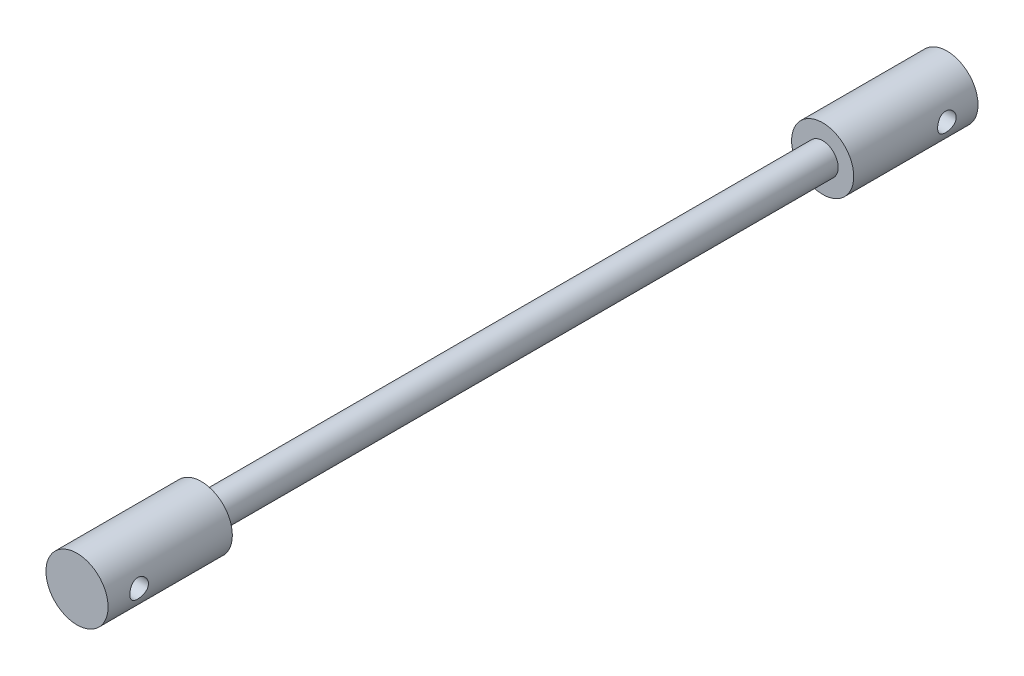
ISO-10303-21;
HEADER;
FILE_DESCRIPTION(('STEP AP214'),'2;1');
FILE_NAME('part.step','',(''),(''),'','','');
FILE_SCHEMA(('AUTOMOTIVE_DESIGN { 1 0 10303 214 1 1 1 1 }'));
ENDSEC;
DATA;
#1=APPLICATION_CONTEXT('core data for automotive mechanical design processes');
#2=APPLICATION_PROTOCOL_DEFINITION('international standard','automotive_design',2000,#1);
#3=PRODUCT_CONTEXT('',#1,'mechanical');
#4=PRODUCT('Part','Part','',(#3));
#5=PRODUCT_RELATED_PRODUCT_CATEGORY('part','',(#4));
#6=PRODUCT_DEFINITION_FORMATION('','',#4);
#7=PRODUCT_DEFINITION_CONTEXT('part definition',#1,'design');
#8=PRODUCT_DEFINITION('design','',#6,#7);
#9=PRODUCT_DEFINITION_SHAPE('','',#8);
#10=(LENGTH_UNIT() NAMED_UNIT(*) SI_UNIT(.MILLI.,.METRE.));
#11=(NAMED_UNIT(*) PLANE_ANGLE_UNIT() SI_UNIT($,.RADIAN.));
#12=(NAMED_UNIT(*) SI_UNIT($,.STERADIAN.) SOLID_ANGLE_UNIT());
#13=UNCERTAINTY_MEASURE_WITH_UNIT(LENGTH_MEASURE(1.E-05),#10,'distance_accuracy_value','');
#14=(GEOMETRIC_REPRESENTATION_CONTEXT(3) GLOBAL_UNCERTAINTY_ASSIGNED_CONTEXT((#13)) GLOBAL_UNIT_ASSIGNED_CONTEXT((#10,
#11,#12)) REPRESENTATION_CONTEXT('',''));
#15=CARTESIAN_POINT('',(0.,0.,0.));
#16=DIRECTION('',(0.,0.,1.));
#17=DIRECTION('',(1.,0.,0.));
#18=AXIS2_PLACEMENT_3D('',#15,#16,#17);
#19=CARTESIAN_POINT('',(0.,0.,20.));
#20=DIRECTION('',(0.,0.,1.));
#21=DIRECTION('',(1.,0.,0.));
#22=AXIS2_PLACEMENT_3D('',#19,#20,#21);
#23=PLANE('',#22);
#24=CARTESIAN_POINT('',(0.,0.,20.));
#25=DIRECTION('',(0.,0.,1.));
#26=DIRECTION('',(1.,0.,0.));
#27=AXIS2_PLACEMENT_3D('',#24,#25,#26);
#28=CIRCLE('',#27,5.);
#29=CARTESIAN_POINT('',(5.,0.,20.));
#30=VERTEX_POINT('',#29);
#31=EDGE_CURVE('E101',#30,#30,#28,.T.);
#32=ORIENTED_EDGE('',*,*,#31,.T.);
#33=EDGE_LOOP('',(#32));
#34=FACE_BOUND('',#33,.T.);
#35=CARTESIAN_POINT('',(0.,0.,20.));
#36=DIRECTION('',(0.,0.,1.));
#37=DIRECTION('',(1.,0.,0.));
#38=AXIS2_PLACEMENT_3D('',#35,#36,#37);
#39=CIRCLE('',#38,2.5);
#40=CARTESIAN_POINT('',(2.5,0.,20.));
#41=VERTEX_POINT('',#40);
#42=EDGE_CURVE('E102',#41,#41,#39,.T.);
#43=ORIENTED_EDGE('',*,*,#42,.F.);
#44=EDGE_LOOP('',(#43));
#45=FACE_BOUND('',#44,.T.);
#46=ADVANCED_FACE('F31',(#34,#45),#23,.T.);
#47=CARTESIAN_POINT('',(0.,0.,20.));
#48=DIRECTION('',(0.,0.,-1.));
#49=DIRECTION('',(-1.,0.,0.));
#50=AXIS2_PLACEMENT_3D('',#47,#48,#49);
#51=CYLINDRICAL_SURFACE('',#50,5.);
#52=CARTESIAN_POINT('',(-5.,0.,3.5));
#53=CARTESIAN_POINT('',(-4.9999992925055,0.0822886127532998,3.50000099748489));
#54=CARTESIAN_POINT('',(-4.99794915693954,0.164587318351529,3.50679386362397));
#55=CARTESIAN_POINT('',(-4.98997105593691,0.32678812530488,3.5337213542221));
#56=CARTESIAN_POINT('',(-4.98404193389692,0.406689504411419,3.55385995802334));
#57=CARTESIAN_POINT('',(-4.96895552501836,0.561732707754526,3.60674601691027));
#58=CARTESIAN_POINT('',(-4.95980300250425,0.636881364395372,3.63947486961894));
#59=CARTESIAN_POINT('',(-4.93922109237645,0.78062418105313,3.71653609305584));
#60=CARTESIAN_POINT('',(-4.92779140192067,0.849217467469668,3.76087000739542));
#61=CARTESIAN_POINT('',(-4.90350737192774,0.979871797183744,3.86122400747267));
#62=CARTESIAN_POINT('',(-4.89062383657036,1.04171807124434,3.91751662588591));
#63=CARTESIAN_POINT('',(-4.86505834210442,1.15524920923324,4.03960922991018));
#64=CARTESIAN_POINT('',(-4.85237641724501,1.20693236327441,4.10541081212496));
#65=CARTESIAN_POINT('',(-4.82834113993772,1.29980037723707,4.24647075303761));
#66=CARTESIAN_POINT('',(-4.81702406663875,1.34072309022213,4.32190846099074));
#67=CARTESIAN_POINT('',(-4.79743620394031,1.4092139477476,4.47898925423029));
#68=CARTESIAN_POINT('',(-4.78916468313311,1.43678529919973,4.56063084392798));
#69=CARTESIAN_POINT('',(-4.77690870838434,1.47701633682652,4.72539026613046));
#70=CARTESIAN_POINT('',(-4.77281069324533,1.49007196234677,4.80840274386394));
#71=CARTESIAN_POINT('',(-4.76902789749767,1.50213730614672,4.97553315621677));
#72=CARTESIAN_POINT('',(-4.76934204760571,1.50115042761078,5.05965081805909));
#73=CARTESIAN_POINT('',(-4.77424744067778,1.48546977199812,5.22338390860848));
#74=CARTESIAN_POINT('',(-4.77868388599141,1.47127205262685,5.30305225036224));
#75=CARTESIAN_POINT('',(-4.79108356228624,1.43037420427056,5.45881978627346));
#76=CARTESIAN_POINT('',(-4.79904714132351,1.40367284141641,5.53491862737433));
#77=CARTESIAN_POINT('',(-4.81772733074973,1.33816026653682,5.68260034966074));
#78=CARTESIAN_POINT('',(-4.82848016115952,1.29918816934642,5.75410708395526));
#79=CARTESIAN_POINT('',(-4.85150987000065,1.21035222588683,5.88973202201019));
#80=CARTESIAN_POINT('',(-4.86378711746991,1.16048574002588,5.95384842941378));
#81=CARTESIAN_POINT('',(-4.88911011297937,1.04881290765546,6.07568619076202));
#82=CARTESIAN_POINT('',(-4.90216654310498,0.986594907466971,6.13302866402967));
#83=CARTESIAN_POINT('',(-4.92712244063259,0.853263259313966,6.23655398406425));
#84=CARTESIAN_POINT('',(-4.9390218351841,0.782149051860887,6.28273612841443));
#85=CARTESIAN_POINT('',(-4.9604316006947,0.632355038342803,6.36285992246473));
#86=CARTESIAN_POINT('',(-4.96992543668314,0.55362774974795,6.39671751624986));
#87=CARTESIAN_POINT('',(-4.98533521832222,0.391245415603519,6.45059959009963));
#88=CARTESIAN_POINT('',(-4.99125216186999,0.307591751589581,6.47062792853249));
#89=CARTESIAN_POINT('',(-4.99868364643538,0.140952242668332,6.49565217789939));
#90=CARTESIAN_POINT('',(-5.0003485041779,0.0580500976011874,6.50116158580161));
#91=CARTESIAN_POINT('',(-4.9995292324176,-0.107499605823382,6.49843084428792));
#92=CARTESIAN_POINT('',(-4.99704565677756,-0.19014719669078,6.49019253034856));
#93=CARTESIAN_POINT('',(-4.98830696987163,-0.350903605309696,6.4606153888885));
#94=CARTESIAN_POINT('',(-4.98213829799417,-0.429072772614168,6.43957661241913));
#95=CARTESIAN_POINT('',(-4.96674347841533,-0.580754638954521,6.3853567672218));
#96=CARTESIAN_POINT('',(-4.95751696321085,-0.654266777025583,6.35217423896214));
#97=CARTESIAN_POINT('',(-4.93669654351325,-0.796437189461051,6.27374683451887));
#98=CARTESIAN_POINT('',(-4.92505280829675,-0.864943826199668,6.22824065905203));
#99=CARTESIAN_POINT('',(-4.90073468764318,-0.993523307980145,6.12677524594719));
#100=CARTESIAN_POINT('',(-4.8880600443108,-1.05359403235593,6.07081338811233));
#101=CARTESIAN_POINT('',(-4.86253171869138,-1.16585744551027,5.94761269163065));
#102=CARTESIAN_POINT('',(-4.84968825033268,-1.21768481231503,5.88003812422826));
#103=CARTESIAN_POINT('',(-4.82576515238464,-1.30928995072153,5.73687206098647));
#104=CARTESIAN_POINT('',(-4.81468547654651,-1.34906803829472,5.66128077544179));
#105=CARTESIAN_POINT('',(-4.79567189615055,-1.41517347127168,5.50446750874531));
#106=CARTESIAN_POINT('',(-4.78772337843827,-1.4415634693705,5.42327381346341));
#107=CARTESIAN_POINT('',(-4.77591594362794,-1.48021730815114,5.25731203106852));
#108=CARTESIAN_POINT('',(-4.772055625083,-1.49248598978779,5.17254517921233));
#109=CARTESIAN_POINT('',(-4.76899972496087,-1.50221984485059,5.00563848162377));
#110=CARTESIAN_POINT('',(-4.76961647442754,-1.5002805530849,4.92353634898241));
#111=CARTESIAN_POINT('',(-4.77499401288294,-1.48307505444813,4.7608858966272));
#112=CARTESIAN_POINT('',(-4.77975463592551,-1.46780938124716,4.68033751482365));
#113=CARTESIAN_POINT('',(-4.79275763670386,-1.42476888804136,4.52405460085715));
#114=CARTESIAN_POINT('',(-4.80095604545965,-1.39715175507068,4.44827271263831));
#115=CARTESIAN_POINT('',(-4.81990278909136,-1.33031507121129,4.30235756118228));
#116=CARTESIAN_POINT('',(-4.83065161194312,-1.29109329962876,4.23222538235924));
#117=CARTESIAN_POINT('',(-4.85397676425833,-1.20048763805072,4.09683688347289));
#118=CARTESIAN_POINT('',(-4.86660540163798,-1.14871276092994,4.03185123873959));
#119=CARTESIAN_POINT('',(-4.89201320450026,-1.03517434629782,3.91129750169214));
#120=CARTESIAN_POINT('',(-4.90479240823905,-0.973408217134501,3.85573186053224));
#121=CARTESIAN_POINT('',(-4.92950936570649,-0.839465762183248,3.75397658770497));
#122=CARTESIAN_POINT('',(-4.94141159765674,-0.767037885790608,3.70810855314451));
#123=CARTESIAN_POINT('',(-4.96260680455813,-0.615141373983529,3.62926483009598));
#124=CARTESIAN_POINT('',(-4.97190099931067,-0.535676052998955,3.59628311172549));
#125=CARTESIAN_POINT('',(-4.98602174969301,-0.380757712655282,3.54710472434725));
#126=CARTESIAN_POINT('',(-4.99122027381068,-0.305786961954234,3.52948832711675));
#127=CARTESIAN_POINT('',(-4.99820944494492,-0.15388019523078,3.50593647475842));
#128=CARTESIAN_POINT('',(-5.0000006615474,-0.0769445098581396,3.49999906729518));
#129=CARTESIAN_POINT('',(-5.,0.,3.5));
#130=B_SPLINE_CURVE_WITH_KNOTS('',3,(#52,#53,#54,#55,#56,#57,#58,#59,#60,#61,#62,#63,#64,#65,
#66,#67,#68,#69,#70,#71,#72,#73,#74,#75,#76,#77,#78,#79,#80,#81,#82,#83,#84,#85,#86,#87,#88,#89,
#90,#91,#92,#93,#94,#95,#96,#97,#98,#99,#100,#101,#102,#103,#104,#105,#106,#107,#108,#109,#110,
#111,#112,#113,#114,#115,#116,#117,#118,#119,#120,#121,#122,#123,#124,#125,#126,#127,#128,#129),
.UNSPECIFIED.,.T.,.F.,(4,2,2,2,2,2,2,2,2,2,2,2,2,2,2,2,2,2,2,2,2,2,2,2,2,2,2,2,2,2,2,2,2,2,2,2,
2,2,4),(0.,0.24658320361261,0.493239964845999,0.739533676300873,0.9858601644127,
1.23855602948191,1.49129437288633,1.74971481004109,2.00807314543223,2.25919689356599,
2.51025978319089,2.75226016697676,2.99428443658001,3.23962426447119,3.48502360158555,
3.74067104048166,3.99633456531071,4.25371046881688,4.51101453528807,4.75908809438544,
5.00712853550326,5.24956746682326,5.49203554593728,5.74011305702908,5.9882528200019,
6.24540400322818,6.5025484425268,6.75847814951251,7.01432009460282,7.25950155466942,
7.50467319661599,7.7468004040272,7.98897397553106,8.2399692567993,8.49102974897501,
8.7494299615667,9.00770911595234,9.23831691930458,9.46888616948873),.UNSPECIFIED.);
#131=CARTESIAN_POINT('',(-5.,0.,3.5));
#132=VERTEX_POINT('',#131);
#133=EDGE_CURVE('E47',#132,#132,#130,.T.);
#134=ORIENTED_EDGE('',*,*,#133,.T.);
#135=EDGE_LOOP('',(#134));
#136=FACE_BOUND('',#135,.T.);
#137=CARTESIAN_POINT('',(5.,0.,3.5));
#138=CARTESIAN_POINT('',(4.9999992925055,-0.0822886127532998,3.50000099748489));
#139=CARTESIAN_POINT('',(4.99794915693954,-0.164587318351529,3.50679386362397));
#140=CARTESIAN_POINT('',(4.98997105593691,-0.32678812530488,3.5337213542221));
#141=CARTESIAN_POINT('',(4.98404193389692,-0.406689504411419,3.55385995802334));
#142=CARTESIAN_POINT('',(4.96895552501836,-0.561732707754526,3.60674601691027));
#143=CARTESIAN_POINT('',(4.95980300250425,-0.636881364395372,3.63947486961894));
#144=CARTESIAN_POINT('',(4.93922109237645,-0.78062418105313,3.71653609305584));
#145=CARTESIAN_POINT('',(4.92779140192067,-0.849217467469668,3.76087000739542));
#146=CARTESIAN_POINT('',(4.90350737192774,-0.979871797183744,3.86122400747267));
#147=CARTESIAN_POINT('',(4.89062383657036,-1.04171807124434,3.91751662588591));
#148=CARTESIAN_POINT('',(4.86505834210442,-1.15524920923324,4.03960922991018));
#149=CARTESIAN_POINT('',(4.85237641724501,-1.20693236327441,4.10541081212496));
#150=CARTESIAN_POINT('',(4.82834113993772,-1.29980037723707,4.24647075303761));
#151=CARTESIAN_POINT('',(4.81702406663875,-1.34072309022213,4.32190846099074));
#152=CARTESIAN_POINT('',(4.79743620394031,-1.4092139477476,4.47898925423029));
#153=CARTESIAN_POINT('',(4.78916468313311,-1.43678529919973,4.56063084392798));
#154=CARTESIAN_POINT('',(4.77690870838434,-1.47701633682652,4.72539026613046));
#155=CARTESIAN_POINT('',(4.77281069324533,-1.49007196234677,4.80840274386394));
#156=CARTESIAN_POINT('',(4.76902789749767,-1.50213730614672,4.97553315621677));
#157=CARTESIAN_POINT('',(4.76934204760571,-1.50115042761078,5.05965081805909));
#158=CARTESIAN_POINT('',(4.77424744067778,-1.48546977199812,5.22338390860848));
#159=CARTESIAN_POINT('',(4.77868388599141,-1.47127205262685,5.30305225036224));
#160=CARTESIAN_POINT('',(4.79108356228624,-1.43037420427056,5.45881978627346));
#161=CARTESIAN_POINT('',(4.79904714132351,-1.40367284141641,5.53491862737433));
#162=CARTESIAN_POINT('',(4.81772733074973,-1.33816026653682,5.68260034966074));
#163=CARTESIAN_POINT('',(4.82848016115952,-1.29918816934642,5.75410708395526));
#164=CARTESIAN_POINT('',(4.85150987000065,-1.21035222588683,5.88973202201019));
#165=CARTESIAN_POINT('',(4.86378711746991,-1.16048574002588,5.95384842941378));
#166=CARTESIAN_POINT('',(4.88911011297937,-1.04881290765546,6.07568619076202));
#167=CARTESIAN_POINT('',(4.90216654310498,-0.986594907466971,6.13302866402967));
#168=CARTESIAN_POINT('',(4.92712244063259,-0.853263259313966,6.23655398406425));
#169=CARTESIAN_POINT('',(4.9390218351841,-0.782149051860887,6.28273612841443));
#170=CARTESIAN_POINT('',(4.9604316006947,-0.632355038342803,6.36285992246473));
#171=CARTESIAN_POINT('',(4.96992543668314,-0.55362774974795,6.39671751624986));
#172=CARTESIAN_POINT('',(4.98533521832222,-0.391245415603519,6.45059959009963));
#173=CARTESIAN_POINT('',(4.99125216186999,-0.307591751589581,6.47062792853249));
#174=CARTESIAN_POINT('',(4.99868364643538,-0.140952242668332,6.49565217789939));
#175=CARTESIAN_POINT('',(5.0003485041779,-0.0580500976011874,6.50116158580161));
#176=CARTESIAN_POINT('',(4.9995292324176,0.107499605823382,6.49843084428792));
#177=CARTESIAN_POINT('',(4.99704565677756,0.19014719669078,6.49019253034856));
#178=CARTESIAN_POINT('',(4.98830696987163,0.350903605309696,6.4606153888885));
#179=CARTESIAN_POINT('',(4.98213829799417,0.429072772614168,6.43957661241913));
#180=CARTESIAN_POINT('',(4.96674347841533,0.580754638954521,6.3853567672218));
#181=CARTESIAN_POINT('',(4.95751696321085,0.654266777025583,6.35217423896214));
#182=CARTESIAN_POINT('',(4.93669654351325,0.796437189461051,6.27374683451887));
#183=CARTESIAN_POINT('',(4.92505280829675,0.864943826199668,6.22824065905203));
#184=CARTESIAN_POINT('',(4.90073468764318,0.993523307980145,6.12677524594719));
#185=CARTESIAN_POINT('',(4.8880600443108,1.05359403235593,6.07081338811233));
#186=CARTESIAN_POINT('',(4.86253171869138,1.16585744551027,5.94761269163065));
#187=CARTESIAN_POINT('',(4.84968825033268,1.21768481231503,5.88003812422826));
#188=CARTESIAN_POINT('',(4.82576515238464,1.30928995072153,5.73687206098647));
#189=CARTESIAN_POINT('',(4.81468547654651,1.34906803829472,5.66128077544179));
#190=CARTESIAN_POINT('',(4.79567189615055,1.41517347127168,5.50446750874531));
#191=CARTESIAN_POINT('',(4.78772337843827,1.4415634693705,5.42327381346341));
#192=CARTESIAN_POINT('',(4.77591594362794,1.48021730815114,5.25731203106852));
#193=CARTESIAN_POINT('',(4.772055625083,1.49248598978779,5.17254517921233));
#194=CARTESIAN_POINT('',(4.76899972496087,1.50221984485059,5.00563848162377));
#195=CARTESIAN_POINT('',(4.76961647442754,1.5002805530849,4.92353634898241));
#196=CARTESIAN_POINT('',(4.77499401288294,1.48307505444813,4.7608858966272));
#197=CARTESIAN_POINT('',(4.77975463592551,1.46780938124716,4.68033751482365));
#198=CARTESIAN_POINT('',(4.79275763670386,1.42476888804136,4.52405460085715));
#199=CARTESIAN_POINT('',(4.80095604545965,1.39715175507068,4.44827271263831));
#200=CARTESIAN_POINT('',(4.81990278909136,1.33031507121129,4.30235756118228));
#201=CARTESIAN_POINT('',(4.83065161194312,1.29109329962876,4.23222538235924));
#202=CARTESIAN_POINT('',(4.85397676425833,1.20048763805072,4.09683688347289));
#203=CARTESIAN_POINT('',(4.86660540163798,1.14871276092994,4.03185123873959));
#204=CARTESIAN_POINT('',(4.89201320450026,1.03517434629782,3.91129750169214));
#205=CARTESIAN_POINT('',(4.90479240823905,0.973408217134501,3.85573186053224));
#206=CARTESIAN_POINT('',(4.92950936570649,0.839465762183248,3.75397658770497));
#207=CARTESIAN_POINT('',(4.94141159765674,0.767037885790608,3.70810855314451));
#208=CARTESIAN_POINT('',(4.96260680455813,0.615141373983529,3.62926483009598));
#209=CARTESIAN_POINT('',(4.97190099931067,0.535676052998955,3.59628311172549));
#210=CARTESIAN_POINT('',(4.98602174969301,0.380757712655282,3.54710472434725));
#211=CARTESIAN_POINT('',(4.99122027381068,0.305786961954234,3.52948832711675));
#212=CARTESIAN_POINT('',(4.99820944494492,0.15388019523078,3.50593647475842));
#213=CARTESIAN_POINT('',(5.0000006615474,0.0769445098581396,3.49999906729518));
#214=CARTESIAN_POINT('',(5.,0.,3.5));
#215=B_SPLINE_CURVE_WITH_KNOTS('',3,(#137,#138,#139,#140,#141,#142,#143,#144,#145,#146,#147,
#148,#149,#150,#151,#152,#153,#154,#155,#156,#157,#158,#159,#160,#161,#162,#163,#164,#165,#166,
#167,#168,#169,#170,#171,#172,#173,#174,#175,#176,#177,#178,#179,#180,#181,#182,#183,#184,#185,
#186,#187,#188,#189,#190,#191,#192,#193,#194,#195,#196,#197,#198,#199,#200,#201,#202,#203,#204,
#205,#206,#207,#208,#209,#210,#211,#212,#213,#214),.UNSPECIFIED.,.T.,.F.,(4,2,2,2,2,2,2,2,2,2,2,
2,2,2,2,2,2,2,2,2,2,2,2,2,2,2,2,2,2,2,2,2,2,2,2,2,2,2,4),(0.,0.24658320361261,0.493239964845999,
0.739533676300873,0.9858601644127,1.23855602948191,1.49129437288633,1.74971481004109,
2.00807314543223,2.25919689356599,2.51025978319089,2.75226016697676,2.99428443658001,
3.23962426447119,3.48502360158555,3.74067104048166,3.99633456531071,4.25371046881688,
4.51101453528807,4.75908809438544,5.00712853550326,5.24956746682326,5.49203554593728,
5.74011305702908,5.9882528200019,6.24540400322818,6.5025484425268,6.75847814951251,
7.01432009460282,7.25950155466942,7.50467319661599,7.7468004040272,7.98897397553106,
8.2399692567993,8.49102974897501,8.7494299615667,9.00770911595234,9.23831691930458,
9.46888616948873),.UNSPECIFIED.);
#216=CARTESIAN_POINT('',(5.,0.,3.5));
#217=VERTEX_POINT('',#216);
#218=EDGE_CURVE('E51',#217,#217,#215,.T.);
#219=ORIENTED_EDGE('',*,*,#218,.T.);
#220=EDGE_LOOP('',(#219));
#221=FACE_BOUND('',#220,.T.);
#222=ORIENTED_EDGE('',*,*,#31,.F.);
#223=EDGE_LOOP('',(#222));
#224=FACE_BOUND('',#223,.T.);
#225=CARTESIAN_POINT('',(0.,0.,0.));
#226=DIRECTION('',(0.,0.,1.));
#227=DIRECTION('',(1.,0.,0.));
#228=AXIS2_PLACEMENT_3D('',#225,#226,#227);
#229=CIRCLE('',#228,5.);
#230=CARTESIAN_POINT('',(5.,0.,0.));
#231=VERTEX_POINT('',#230);
#232=EDGE_CURVE('E99',#231,#231,#229,.T.);
#233=ORIENTED_EDGE('',*,*,#232,.T.);
#234=EDGE_LOOP('',(#233));
#235=FACE_BOUND('',#234,.T.);
#236=ADVANCED_FACE('F33',(#136,#221,#224,#235),#51,.T.);
#237=CARTESIAN_POINT('',(0.,0.,0.));
#238=DIRECTION('',(0.,0.,1.));
#239=DIRECTION('',(1.,0.,0.));
#240=AXIS2_PLACEMENT_3D('',#237,#238,#239);
#241=PLANE('',#240);
#242=ORIENTED_EDGE('',*,*,#232,.F.);
#243=EDGE_LOOP('',(#242));
#244=FACE_BOUND('',#243,.T.);
#245=ADVANCED_FACE('F85',(#244),#241,.F.);
#246=CARTESIAN_POINT('',(0.,0.,70.));
#247=DIRECTION('',(0.,0.,-1.));
#248=DIRECTION('',(-1.,0.,0.));
#249=AXIS2_PLACEMENT_3D('',#246,#247,#248);
#250=CYLINDRICAL_SURFACE('',#249,2.5);
#251=ORIENTED_EDGE('',*,*,#42,.T.);
#252=EDGE_LOOP('',(#251));
#253=FACE_BOUND('',#252,.T.);
#254=CARTESIAN_POINT('',(0.,0.,120.));
#255=DIRECTION('',(0.,0.,1.));
#256=DIRECTION('',(1.,0.,0.));
#257=AXIS2_PLACEMENT_3D('',#254,#255,#256);
#258=CIRCLE('',#257,2.5);
#259=CARTESIAN_POINT('',(2.5,0.,120.));
#260=VERTEX_POINT('',#259);
#261=EDGE_CURVE('E106',#260,#260,#258,.T.);
#262=ORIENTED_EDGE('',*,*,#261,.F.);
#263=EDGE_LOOP('',(#262));
#264=FACE_BOUND('',#263,.T.);
#265=ADVANCED_FACE('F90',(#253,#264),#250,.T.);
#266=CARTESIAN_POINT('',(-5.,0.,5.));
#267=DIRECTION('',(1.,0.,0.));
#268=DIRECTION('',(0.,0.,-1.));
#269=AXIS2_PLACEMENT_3D('',#266,#267,#268);
#270=CYLINDRICAL_SURFACE('',#269,1.5);
#271=ORIENTED_EDGE('',*,*,#218,.F.);
#272=EDGE_LOOP('',(#271));
#273=FACE_BOUND('',#272,.T.);
#274=ORIENTED_EDGE('',*,*,#133,.F.);
#275=EDGE_LOOP('',(#274));
#276=FACE_BOUND('',#275,.T.);
#277=ADVANCED_FACE('F70',(#273,#276),#270,.F.);
#278=CARTESIAN_POINT('',(0.,0.,120.));
#279=DIRECTION('',(0.,0.,-1.));
#280=DIRECTION('',(1.,0.,0.));
#281=AXIS2_PLACEMENT_3D('',#278,#279,#280);
#282=PLANE('',#281);
#283=CARTESIAN_POINT('',(0.,0.,120.));
#284=DIRECTION('',(0.,0.,1.));
#285=DIRECTION('',(1.,0.,0.));
#286=AXIS2_PLACEMENT_3D('',#283,#284,#285);
#287=CIRCLE('',#286,5.);
#288=CARTESIAN_POINT('',(5.,0.,120.));
#289=VERTEX_POINT('',#288);
#290=EDGE_CURVE('E175',#289,#289,#287,.T.);
#291=ORIENTED_EDGE('',*,*,#290,.F.);
#292=EDGE_LOOP('',(#291));
#293=FACE_BOUND('',#292,.T.);
#294=ORIENTED_EDGE('',*,*,#261,.T.);
#295=EDGE_LOOP('',(#294));
#296=FACE_BOUND('',#295,.T.);
#297=ADVANCED_FACE('F67',(#293,#296),#282,.T.);
#298=CARTESIAN_POINT('',(0.,0.,120.));
#299=DIRECTION('',(0.,0.,1.));
#300=DIRECTION('',(1.,0.,0.));
#301=AXIS2_PLACEMENT_3D('',#298,#299,#300);
#302=CYLINDRICAL_SURFACE('',#301,5.);
#303=CARTESIAN_POINT('',(-5.,0.,133.5));
#304=CARTESIAN_POINT('',(-4.9999992925055,-0.0822886127533159,133.500000997485));
#305=CARTESIAN_POINT('',(-4.99794915693954,-0.164587318351546,133.506793863624));
#306=CARTESIAN_POINT('',(-4.98997105593691,-0.326788125304897,133.533721354222));
#307=CARTESIAN_POINT('',(-4.98404193389692,-0.406689504411434,133.553859958023));
#308=CARTESIAN_POINT('',(-4.96895552501836,-0.561732707754537,133.60674601691));
#309=CARTESIAN_POINT('',(-4.95980300250425,-0.636881364395381,133.639474869619));
#310=CARTESIAN_POINT('',(-4.93922109237645,-0.78062418105314,133.716536093056));
#311=CARTESIAN_POINT('',(-4.92779140192066,-0.849217467469681,133.760870007395));
#312=CARTESIAN_POINT('',(-4.90350737192774,-0.979871797183756,133.861224007473));
#313=CARTESIAN_POINT('',(-4.89062383657036,-1.04171807124435,133.917516625886));
#314=CARTESIAN_POINT('',(-4.86505834210442,-1.15524920923324,134.03960922991));
#315=CARTESIAN_POINT('',(-4.85237641724501,-1.20693236327441,134.105410812125));
#316=CARTESIAN_POINT('',(-4.82834113993772,-1.29980037723708,134.246470753038));
#317=CARTESIAN_POINT('',(-4.81702406663875,-1.34072309022214,134.321908460991));
#318=CARTESIAN_POINT('',(-4.79743620394031,-1.40921394774761,134.47898925423));
#319=CARTESIAN_POINT('',(-4.7891646831331,-1.43678529919974,134.560630843928));
#320=CARTESIAN_POINT('',(-4.77690870838434,-1.47701633682653,134.72539026613));
#321=CARTESIAN_POINT('',(-4.77281069324533,-1.49007196234679,134.808402743864));
#322=CARTESIAN_POINT('',(-4.76902789749767,-1.50213730614673,134.975533156217));
#323=CARTESIAN_POINT('',(-4.76934204760571,-1.5011504276108,135.059650818059));
#324=CARTESIAN_POINT('',(-4.77424744067777,-1.48546977199813,135.223383908608));
#325=CARTESIAN_POINT('',(-4.7786838859914,-1.47127205262687,135.303052250362));
#326=CARTESIAN_POINT('',(-4.79108356228623,-1.43037420427058,135.458819786273));
#327=CARTESIAN_POINT('',(-4.7990471413235,-1.40367284141643,135.534918627374));
#328=CARTESIAN_POINT('',(-4.81772733074972,-1.33816026653684,135.682600349661));
#329=CARTESIAN_POINT('',(-4.82848016115951,-1.29918816934645,135.754107083955));
#330=CARTESIAN_POINT('',(-4.85150987000064,-1.21035222588686,135.88973202201));
#331=CARTESIAN_POINT('',(-4.8637871174699,-1.16048574002591,135.953848429414));
#332=CARTESIAN_POINT('',(-4.88911011297937,-1.04881290765549,136.075686190762));
#333=CARTESIAN_POINT('',(-4.90216654310497,-0.986594907467001,136.13302866403));
#334=CARTESIAN_POINT('',(-4.92712244063258,-0.853263259313991,136.236553984064));
#335=CARTESIAN_POINT('',(-4.9390218351841,-0.782149051860904,136.282736128414));
#336=CARTESIAN_POINT('',(-4.9604316006947,-0.632355038342814,136.362859922465));
#337=CARTESIAN_POINT('',(-4.96992543668314,-0.553627749747963,136.39671751625));
#338=CARTESIAN_POINT('',(-4.98533521832222,-0.391245415603533,136.4505995901));
#339=CARTESIAN_POINT('',(-4.99125216186999,-0.307591751589593,136.470627928533));
#340=CARTESIAN_POINT('',(-4.99868364643538,-0.140952242668344,136.495652177899));
#341=CARTESIAN_POINT('',(-5.0003485041779,-0.0580500976012007,136.501161585802));
#342=CARTESIAN_POINT('',(-4.9995292324176,0.107499605823366,136.498430844288));
#343=CARTESIAN_POINT('',(-4.99704565677756,0.190147196690763,136.490192530349));
#344=CARTESIAN_POINT('',(-4.98830696987163,0.350903605309677,136.460615388888));
#345=CARTESIAN_POINT('',(-4.98213829799417,0.429072772614148,136.439576612419));
#346=CARTESIAN_POINT('',(-4.96674347841533,0.580754638954502,136.385356767222));
#347=CARTESIAN_POINT('',(-4.95751696321085,0.654266777025566,136.352174238962));
#348=CARTESIAN_POINT('',(-4.93669654351325,0.796437189461033,136.273746834519));
#349=CARTESIAN_POINT('',(-4.92505280829675,0.864943826199646,136.228240659052));
#350=CARTESIAN_POINT('',(-4.90073468764318,0.993523307980123,136.126775245947));
#351=CARTESIAN_POINT('',(-4.8880600443108,1.05359403235591,136.070813388112));
#352=CARTESIAN_POINT('',(-4.86253171869138,1.16585744551026,135.947612691631));
#353=CARTESIAN_POINT('',(-4.84968825033268,1.21768481231503,135.880038124228));
#354=CARTESIAN_POINT('',(-4.82576515238464,1.30928995072152,135.736872060986));
#355=CARTESIAN_POINT('',(-4.81468547654652,1.3490680382947,135.661280775442));
#356=CARTESIAN_POINT('',(-4.79567189615056,1.41517347127166,135.504467508745));
#357=CARTESIAN_POINT('',(-4.78772337843828,1.44156346937048,135.423273813463));
#358=CARTESIAN_POINT('',(-4.77591594362795,1.48021730815112,135.257312031069));
#359=CARTESIAN_POINT('',(-4.77205562508301,1.49248598978777,135.172545179212));
#360=CARTESIAN_POINT('',(-4.76899972496087,1.50221984485057,135.005638481624));
#361=CARTESIAN_POINT('',(-4.76961647442755,1.50028055308488,134.923536348982));
#362=CARTESIAN_POINT('',(-4.77499401288295,1.48307505444811,134.760885896627));
#363=CARTESIAN_POINT('',(-4.77975463592552,1.46780938124714,134.680337514824));
#364=CARTESIAN_POINT('',(-4.79275763670386,1.42476888804133,134.524054600857));
#365=CARTESIAN_POINT('',(-4.80095604545965,1.39715175507066,134.448272712638));
#366=CARTESIAN_POINT('',(-4.81990278909137,1.33031507121126,134.302357561182));
#367=CARTESIAN_POINT('',(-4.83065161194313,1.29109329962873,134.232225382359));
#368=CARTESIAN_POINT('',(-4.85397676425834,1.20048763805069,134.096836883473));
#369=CARTESIAN_POINT('',(-4.86660540163798,1.14871276092992,134.03185123874));
#370=CARTESIAN_POINT('',(-4.89201320450026,1.0351743462978,133.911297501692));
#371=CARTESIAN_POINT('',(-4.90479240823906,0.97340821713448,133.855731860532));
#372=CARTESIAN_POINT('',(-4.92950936570649,0.839465762183222,133.753976587705));
#373=CARTESIAN_POINT('',(-4.94141159765674,0.767037885790581,133.708108553145));
#374=CARTESIAN_POINT('',(-4.96260680455813,0.615141373983508,133.629264830096));
#375=CARTESIAN_POINT('',(-4.97190099931067,0.53567605299894,133.596283111726));
#376=CARTESIAN_POINT('',(-4.98602174969301,0.380757712655269,133.547104724347));
#377=CARTESIAN_POINT('',(-4.99122027381068,0.305786961954218,133.529488327117));
#378=CARTESIAN_POINT('',(-4.99820944494492,0.153880195230761,133.505936474758));
#379=CARTESIAN_POINT('',(-5.0000006615474,0.0769445098581227,133.499999067295));
#380=CARTESIAN_POINT('',(-5.,0.,133.5));
#381=B_SPLINE_CURVE_WITH_KNOTS('',3,(#303,#304,#305,#306,#307,#308,#309,#310,#311,#312,#313,
#314,#315,#316,#317,#318,#319,#320,#321,#322,#323,#324,#325,#326,#327,#328,#329,#330,#331,#332,
#333,#334,#335,#336,#337,#338,#339,#340,#341,#342,#343,#344,#345,#346,#347,#348,#349,#350,#351,
#352,#353,#354,#355,#356,#357,#358,#359,#360,#361,#362,#363,#364,#365,#366,#367,#368,#369,#370,
#371,#372,#373,#374,#375,#376,#377,#378,#379,#380),.UNSPECIFIED.,.T.,.F.,(4,2,2,2,2,2,2,2,2,2,2,
2,2,2,2,2,2,2,2,2,2,2,2,2,2,2,2,2,2,2,2,2,2,2,2,2,2,2,4),(0.,0.246583203612611,
0.493239964845998,0.739533676300865,0.985860164412687,1.2385560294819,1.49129437288631,
1.74971481004104,2.00807314543224,2.25919689356599,2.51025978319088,2.75226016697672,
2.99428443657997,3.23962426447116,3.48502360158553,3.74067104048165,3.9963345653107,
4.25371046881688,4.51101453528808,4.75908809438544,5.00712853550326,5.24956746682326,
5.49203554593727,5.74011305702907,5.98825282000191,6.2454040032282,6.5025484425268,
6.75847814951251,7.01432009460282,7.25950155466944,7.50467319661601,7.74680040402721,
7.98897397553107,8.2399692567993,8.49102974897501,8.74942996156669,9.00770911595233,
9.23831691930457,9.46888616948872),.UNSPECIFIED.);
#382=CARTESIAN_POINT('',(-5.,0.,133.5));
#383=VERTEX_POINT('',#382);
#384=EDGE_CURVE('E10',#383,#383,#381,.T.);
#385=ORIENTED_EDGE('',*,*,#384,.F.);
#386=EDGE_LOOP('',(#385));
#387=FACE_BOUND('',#386,.T.);
#388=CARTESIAN_POINT('',(5.,0.,133.5));
#389=CARTESIAN_POINT('',(4.9999992925055,0.0822886127533003,133.500000997485));
#390=CARTESIAN_POINT('',(4.99794915693954,0.164587318351531,133.506793863624));
#391=CARTESIAN_POINT('',(4.98997105593691,0.326788125304881,133.533721354222));
#392=CARTESIAN_POINT('',(4.98404193389692,0.406689504411418,133.553859958023));
#393=CARTESIAN_POINT('',(4.96895552501836,0.561732707754524,133.60674601691));
#394=CARTESIAN_POINT('',(4.95980300250426,0.636881364395372,133.639474869619));
#395=CARTESIAN_POINT('',(4.93922109237645,0.780624181053126,133.716536093056));
#396=CARTESIAN_POINT('',(4.92779140192067,0.849217467469657,133.760870007395));
#397=CARTESIAN_POINT('',(4.90350737192774,0.979871797183725,133.861224007473));
#398=CARTESIAN_POINT('',(4.89062383657037,1.04171807124432,133.917516625886));
#399=CARTESIAN_POINT('',(4.86505834210443,1.15524920923322,134.03960922991));
#400=CARTESIAN_POINT('',(4.85237641724502,1.2069323632744,134.105410812125));
#401=CARTESIAN_POINT('',(4.82834113993772,1.29980037723707,134.246470753038));
#402=CARTESIAN_POINT('',(4.81702406663875,1.34072309022213,134.321908460991));
#403=CARTESIAN_POINT('',(4.79743620394031,1.40921394774759,134.47898925423));
#404=CARTESIAN_POINT('',(4.78916468313311,1.43678529919972,134.560630843928));
#405=CARTESIAN_POINT('',(4.77690870838435,1.4770163368265,134.725390266131));
#406=CARTESIAN_POINT('',(4.77281069324534,1.49007196234676,134.808402743864));
#407=CARTESIAN_POINT('',(4.76902789749768,1.5021373061467,134.975533156217));
#408=CARTESIAN_POINT('',(4.76934204760572,1.50115042761076,135.059650818059));
#409=CARTESIAN_POINT('',(4.77424744067778,1.4854697719981,135.223383908608));
#410=CARTESIAN_POINT('',(4.77868388599141,1.47127205262684,135.303052250362));
#411=CARTESIAN_POINT('',(4.79108356228625,1.43037420427055,135.458819786273));
#412=CARTESIAN_POINT('',(4.79904714132351,1.40367284141639,135.534918627374));
#413=CARTESIAN_POINT('',(4.81772733074974,1.3381602665368,135.682600349661));
#414=CARTESIAN_POINT('',(4.82848016115953,1.2991881693464,135.754107083955));
#415=CARTESIAN_POINT('',(4.85150987000065,1.21035222588681,135.88973202201));
#416=CARTESIAN_POINT('',(4.86378711746992,1.16048574002585,135.953848429414));
#417=CARTESIAN_POINT('',(4.88911011297938,1.04881290765543,136.075686190762));
#418=CARTESIAN_POINT('',(4.90216654310499,0.986594907466932,136.13302866403));
#419=CARTESIAN_POINT('',(4.92712244063259,0.853263259313931,136.236553984064));
#420=CARTESIAN_POINT('',(4.93902183518411,0.782149051860859,136.282736128414));
#421=CARTESIAN_POINT('',(4.96043160069471,0.632355038342773,136.362859922465));
#422=CARTESIAN_POINT('',(4.96992543668314,0.553627749747911,136.39671751625));
#423=CARTESIAN_POINT('',(4.98533521832222,0.391245415603474,136.4505995901));
#424=CARTESIAN_POINT('',(4.99125216187,0.307591751589539,136.470627928533));
#425=CARTESIAN_POINT('',(4.99868364643538,0.140952242668294,136.495652177899));
#426=CARTESIAN_POINT('',(5.0003485041779,0.0580500976011505,136.501161585802));
#427=CARTESIAN_POINT('',(4.99952923241759,-0.107499605823416,136.498430844288));
#428=CARTESIAN_POINT('',(4.99704565677756,-0.190147196690811,136.490192530349));
#429=CARTESIAN_POINT('',(4.98830696987163,-0.350903605309723,136.460615388888));
#430=CARTESIAN_POINT('',(4.98213829799416,-0.429072772614193,136.439576612419));
#431=CARTESIAN_POINT('',(4.96674347841532,-0.580754638954546,136.385356767222));
#432=CARTESIAN_POINT('',(4.95751696321084,-0.65426677702561,136.352174238962));
#433=CARTESIAN_POINT('',(4.93669654351324,-0.796437189461076,136.273746834519));
#434=CARTESIAN_POINT('',(4.92505280829675,-0.864943826199688,136.228240659052));
#435=CARTESIAN_POINT('',(4.90073468764317,-0.993523307980164,136.126775245947));
#436=CARTESIAN_POINT('',(4.88806004431079,-1.05359403235596,136.070813388112));
#437=CARTESIAN_POINT('',(4.86253171869137,-1.1658574455103,135.947612691631));
#438=CARTESIAN_POINT('',(4.84968825033267,-1.21768481231507,135.880038124228));
#439=CARTESIAN_POINT('',(4.82576515238463,-1.30928995072156,135.736872060986));
#440=CARTESIAN_POINT('',(4.81468547654651,-1.34906803829474,135.661280775442));
#441=CARTESIAN_POINT('',(4.79567189615054,-1.4151734712717,135.504467508745));
#442=CARTESIAN_POINT('',(4.78772337843826,-1.44156346937052,135.423273813463));
#443=CARTESIAN_POINT('',(4.77591594362794,-1.48021730815116,135.257312031068));
#444=CARTESIAN_POINT('',(4.772055625083,-1.49248598978781,135.172545179212));
#445=CARTESIAN_POINT('',(4.76899972496086,-1.5022198448506,135.005638481624));
#446=CARTESIAN_POINT('',(4.76961647442754,-1.50028055308491,134.923536348982));
#447=CARTESIAN_POINT('',(4.77499401288294,-1.48307505444814,134.760885896627));
#448=CARTESIAN_POINT('',(4.77975463592551,-1.46780938124717,134.680337514824));
#449=CARTESIAN_POINT('',(4.79275763670385,-1.42476888804137,134.524054600857));
#450=CARTESIAN_POINT('',(4.80095604545964,-1.39715175507069,134.448272712638));
#451=CARTESIAN_POINT('',(4.81990278909136,-1.33031507121129,134.302357561182));
#452=CARTESIAN_POINT('',(4.83065161194312,-1.29109329962876,134.232225382359));
#453=CARTESIAN_POINT('',(4.85397676425833,-1.20048763805073,134.096836883473));
#454=CARTESIAN_POINT('',(4.86660540163797,-1.14871276092995,134.03185123874));
#455=CARTESIAN_POINT('',(4.89201320450026,-1.03517434629783,133.911297501692));
#456=CARTESIAN_POINT('',(4.90479240823905,-0.973408217134509,133.855731860532));
#457=CARTESIAN_POINT('',(4.92950936570649,-0.839465762183252,133.753976587705));
#458=CARTESIAN_POINT('',(4.94141159765674,-0.767037885790612,133.708108553144));
#459=CARTESIAN_POINT('',(4.96260680455813,-0.615141373983533,133.629264830096));
#460=CARTESIAN_POINT('',(4.97190099931066,-0.535676052998956,133.596283111725));
#461=CARTESIAN_POINT('',(4.98602174969301,-0.380757712655279,133.547104724347));
#462=CARTESIAN_POINT('',(4.99122027381068,-0.305786961954231,133.529488327117));
#463=CARTESIAN_POINT('',(4.99820944494492,-0.153880195230777,133.505936474758));
#464=CARTESIAN_POINT('',(5.0000006615474,-0.0769445098581386,133.499999067295));
#465=CARTESIAN_POINT('',(5.,0.,133.5));
#466=B_SPLINE_CURVE_WITH_KNOTS('',3,(#388,#389,#390,#391,#392,#393,#394,#395,#396,#397,#398,
#399,#400,#401,#402,#403,#404,#405,#406,#407,#408,#409,#410,#411,#412,#413,#414,#415,#416,#417,
#418,#419,#420,#421,#422,#423,#424,#425,#426,#427,#428,#429,#430,#431,#432,#433,#434,#435,#436,
#437,#438,#439,#440,#441,#442,#443,#444,#445,#446,#447,#448,#449,#450,#451,#452,#453,#454,#455,
#456,#457,#458,#459,#460,#461,#462,#463,#464,#465),.UNSPECIFIED.,.T.,.F.,(4,2,2,2,2,2,2,2,2,2,2,
2,2,2,2,2,2,2,2,2,2,2,2,2,2,2,2,2,2,2,2,2,2,2,2,2,2,2,4),(0.,0.246583203612612,
0.493239964845999,0.739533676300869,0.985860164412696,1.23855602948189,1.49129437288633,
1.74971481004109,2.00807314543225,2.25919689356597,2.51025978319087,2.7522601669767,
2.99428443657999,3.23962426447118,3.48502360158555,3.74067104048167,3.99633456531071,
4.25371046881689,4.51101453528808,4.75908809438545,5.00712853550326,5.24956746682325,
5.49203554593727,5.74011305702906,5.9882528200019,6.24540400322819,6.50254844252682,
6.75847814951253,7.01432009460283,7.25950155466943,7.504673196616,7.7468004040272,
7.98897397553106,8.23996925679929,8.491029748975,8.7494299615667,9.00770911595235,
9.23831691930459,9.46888616948873),.UNSPECIFIED.);
#467=CARTESIAN_POINT('',(5.,0.,133.5));
#468=VERTEX_POINT('',#467);
#469=EDGE_CURVE('E43',#468,#468,#466,.T.);
#470=ORIENTED_EDGE('',*,*,#469,.F.);
#471=EDGE_LOOP('',(#470));
#472=FACE_BOUND('',#471,.T.);
#473=ORIENTED_EDGE('',*,*,#290,.T.);
#474=EDGE_LOOP('',(#473));
#475=FACE_BOUND('',#474,.T.);
#476=CARTESIAN_POINT('',(0.,0.,140.));
#477=DIRECTION('',(0.,0.,1.));
#478=DIRECTION('',(1.,0.,0.));
#479=AXIS2_PLACEMENT_3D('',#476,#477,#478);
#480=CIRCLE('',#479,5.);
#481=CARTESIAN_POINT('',(5.,0.,140.));
#482=VERTEX_POINT('',#481);
#483=EDGE_CURVE('E176',#482,#482,#480,.T.);
#484=ORIENTED_EDGE('',*,*,#483,.F.);
#485=EDGE_LOOP('',(#484));
#486=FACE_BOUND('',#485,.T.);
#487=ADVANCED_FACE('F59',(#387,#472,#475,#486),#302,.T.);
#488=CARTESIAN_POINT('',(0.,0.,140.));
#489=DIRECTION('',(0.,0.,-1.));
#490=DIRECTION('',(1.,0.,0.));
#491=AXIS2_PLACEMENT_3D('',#488,#489,#490);
#492=PLANE('',#491);
#493=ORIENTED_EDGE('',*,*,#483,.T.);
#494=EDGE_LOOP('',(#493));
#495=FACE_BOUND('',#494,.T.);
#496=ADVANCED_FACE('F66',(#495),#492,.F.);
#497=CARTESIAN_POINT('',(-5.,0.,135.));
#498=DIRECTION('',(1.,0.,0.));
#499=DIRECTION('',(0.,0.,-1.));
#500=AXIS2_PLACEMENT_3D('',#497,#498,#499);
#501=CYLINDRICAL_SURFACE('',#500,1.5);
#502=ORIENTED_EDGE('',*,*,#384,.T.);
#503=EDGE_LOOP('',(#502));
#504=FACE_BOUND('',#503,.T.);
#505=ORIENTED_EDGE('',*,*,#469,.T.);
#506=EDGE_LOOP('',(#505));
#507=FACE_BOUND('',#506,.T.);
#508=ADVANCED_FACE('F62',(#504,#507),#501,.F.);
#509=CLOSED_SHELL('',(#46,#236,#245,#265,#277,#297,#487,#496,#508));
#510=MANIFOLD_SOLID_BREP('B2',#509);
#511=ADVANCED_BREP_SHAPE_REPRESENTATION('',(#18,#510),#14);
#512=SHAPE_DEFINITION_REPRESENTATION(#9,#511);
ENDSEC;
END-ISO-10303-21;
